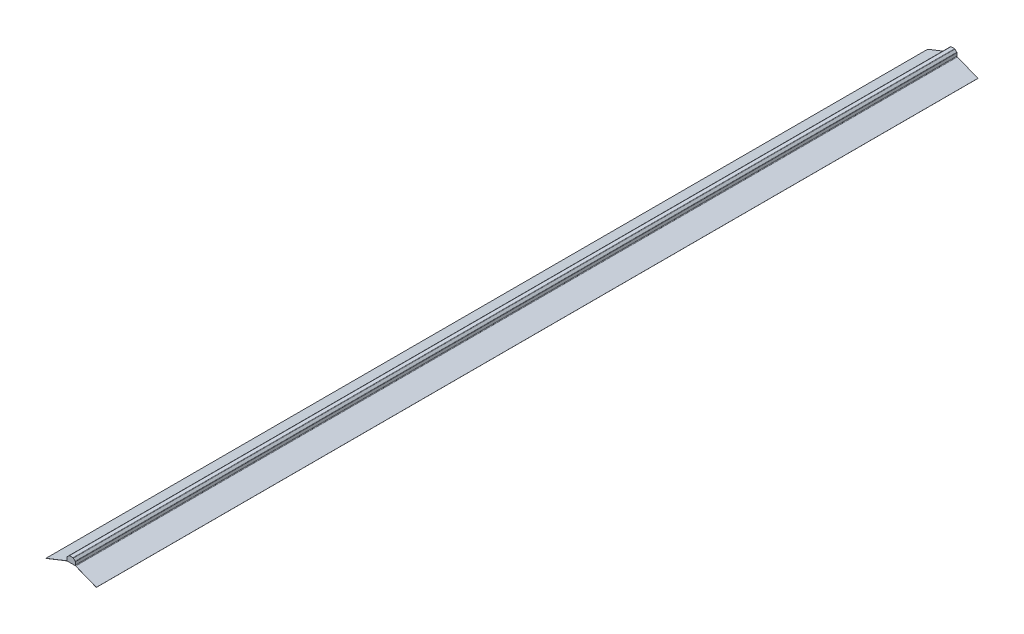
ISO-10303-21;
HEADER;
FILE_DESCRIPTION(('STEP AP214'),'2;1');
FILE_NAME('part.step','',(''),(''),'','','');
FILE_SCHEMA(('AUTOMOTIVE_DESIGN { 1 0 10303 214 1 1 1 1 }'));
ENDSEC;
DATA;
#1=APPLICATION_CONTEXT('core data for automotive mechanical design processes');
#2=APPLICATION_PROTOCOL_DEFINITION('international standard','automotive_design',2000,#1);
#3=PRODUCT_CONTEXT('',#1,'mechanical');
#4=PRODUCT('Part','Part','',(#3));
#5=PRODUCT_RELATED_PRODUCT_CATEGORY('part','',(#4));
#6=PRODUCT_DEFINITION_FORMATION('','',#4);
#7=PRODUCT_DEFINITION_CONTEXT('part definition',#1,'design');
#8=PRODUCT_DEFINITION('design','',#6,#7);
#9=PRODUCT_DEFINITION_SHAPE('','',#8);
#10=(LENGTH_UNIT() NAMED_UNIT(*) SI_UNIT(.MILLI.,.METRE.));
#11=(NAMED_UNIT(*) PLANE_ANGLE_UNIT() SI_UNIT($,.RADIAN.));
#12=(NAMED_UNIT(*) SI_UNIT($,.STERADIAN.) SOLID_ANGLE_UNIT());
#13=UNCERTAINTY_MEASURE_WITH_UNIT(LENGTH_MEASURE(1.E-05),#10,'distance_accuracy_value','');
#14=(GEOMETRIC_REPRESENTATION_CONTEXT(3) GLOBAL_UNCERTAINTY_ASSIGNED_CONTEXT((#13)) GLOBAL_UNIT_ASSIGNED_CONTEXT((#10,
#11,#12)) REPRESENTATION_CONTEXT('',''));
#15=CARTESIAN_POINT('',(0.,0.,0.));
#16=DIRECTION('',(0.,0.,1.));
#17=DIRECTION('',(1.,0.,0.));
#18=AXIS2_PLACEMENT_3D('',#15,#16,#17);
#19=CARTESIAN_POINT('',(37.00272,0.,-3962.146));
#20=DIRECTION('',(0.,-1.,0.));
#21=DIRECTION('',(0.,0.,-1.));
#22=AXIS2_PLACEMENT_3D('',#19,#20,#21);
#23=PLANE('',#22);
#24=DIRECTION('',(0.,0.,1.));
#25=VECTOR('',#24,1.);
#26=CARTESIAN_POINT('',(-37.00272,0.,-3962.146));
#27=LINE('',#26,#25);
#28=CARTESIAN_POINT('',(-37.00272,0.,3961.3332));
#29=VERTEX_POINT('',#28);
#30=CARTESIAN_POINT('',(-37.00272,0.,3962.146));
#31=VERTEX_POINT('',#30);
#32=EDGE_CURVE('E384',#29,#31,#27,.T.);
#33=ORIENTED_EDGE('',*,*,#32,.F.);
#34=DIRECTION('',(1.,0.,0.));
#35=VECTOR('',#34,1.);
#36=CARTESIAN_POINT('',(0.,0.,3961.3332));
#37=LINE('',#36,#35);
#38=CARTESIAN_POINT('',(37.00272,0.,3961.3332));
#39=VERTEX_POINT('',#38);
#40=EDGE_CURVE('E45',#29,#39,#37,.T.);
#41=ORIENTED_EDGE('',*,*,#40,.T.);
#42=DIRECTION('',(0.,0.,1.));
#43=VECTOR('',#42,1.);
#44=CARTESIAN_POINT('',(37.00272,0.,-3962.146));
#45=LINE('',#44,#43);
#46=CARTESIAN_POINT('',(37.00272,0.,3962.146));
#47=VERTEX_POINT('',#46);
#48=EDGE_CURVE('E379',#39,#47,#45,.T.);
#49=ORIENTED_EDGE('',*,*,#48,.T.);
#50=DIRECTION('',(1.,0.,0.));
#51=VECTOR('',#50,1.);
#52=CARTESIAN_POINT('',(37.00272,0.,3962.146));
#53=LINE('',#52,#51);
#54=EDGE_CURVE('E341',#31,#47,#53,.T.);
#55=ORIENTED_EDGE('',*,*,#54,.F.);
#56=EDGE_LOOP('',(#33,#41,#49,#55));
#57=FACE_BOUND('',#56,.T.);
#58=ADVANCED_FACE('F36',(#57),#23,.T.);
#59=CARTESIAN_POINT('',(37.00272,0.,-3962.146));
#60=DIRECTION('',(-0.366842217949024,-0.930283175775119,0.));
#61=DIRECTION('',(0.930283175775119,-0.366842217949024,0.));
#62=AXIS2_PLACEMENT_3D('',#59,#60,#61);
#63=PLANE('',#62);
#64=DIRECTION('',(0.,0.,1.));
#65=VECTOR('',#64,1.);
#66=CARTESIAN_POINT('',(226.036261317504,-74.5423386872416,-3962.146));
#67=LINE('',#66,#65);
#68=CARTESIAN_POINT('',(226.036261317504,-74.5423386872416,-3962.146));
#69=VERTEX_POINT('',#68);
#70=CARTESIAN_POINT('',(226.036261317504,-74.5423386872416,3962.146));
#71=VERTEX_POINT('',#70);
#72=EDGE_CURVE('E373',#69,#71,#67,.T.);
#73=ORIENTED_EDGE('',*,*,#72,.T.);
#74=DIRECTION('',(0.930283175775119,-0.366842217949023,0.));
#75=VECTOR('',#74,1.);
#76=CARTESIAN_POINT('',(37.00272,0.,3962.146));
#77=LINE('',#76,#75);
#78=EDGE_CURVE('E315',#47,#71,#77,.T.);
#79=ORIENTED_EDGE('',*,*,#78,.F.);
#80=ORIENTED_EDGE('',*,*,#48,.F.);
#81=CARTESIAN_POINT('',(37.00272,0.,-3961.3332));
#82=VERTEX_POINT('',#81);
#83=EDGE_CURVE('E378',#82,#39,#45,.T.);
#84=ORIENTED_EDGE('',*,*,#83,.F.);
#85=CARTESIAN_POINT('',(37.00272,0.,-3962.146));
#86=VERTEX_POINT('',#85);
#87=EDGE_CURVE('E374',#86,#82,#45,.T.);
#88=ORIENTED_EDGE('',*,*,#87,.F.);
#89=DIRECTION('',(0.930283175775119,-0.366842217949023,0.));
#90=VECTOR('',#89,1.);
#91=CARTESIAN_POINT('',(37.00272,0.,-3962.146));
#92=LINE('',#91,#90);
#93=EDGE_CURVE('E344',#86,#69,#92,.T.);
#94=ORIENTED_EDGE('',*,*,#93,.T.);
#95=EDGE_LOOP('',(#73,#79,#80,#84,#88,#94));
#96=FACE_BOUND('',#95,.T.);
#97=ADVANCED_FACE('F527',(#96),#63,.T.);
#98=DIRECTION('',(1.,0.,0.));
#99=VECTOR('',#98,1.);
#100=CARTESIAN_POINT('',(0.,0.,-3961.3332));
#101=LINE('',#100,#99);
#102=CARTESIAN_POINT('',(-37.00272,0.,-3961.3332));
#103=VERTEX_POINT('',#102);
#104=EDGE_CURVE('E11',#103,#82,#101,.T.);
#105=ORIENTED_EDGE('',*,*,#104,.F.);
#106=CARTESIAN_POINT('',(-37.00272,0.,-3962.146));
#107=VERTEX_POINT('',#106);
#108=EDGE_CURVE('E380',#107,#103,#27,.T.);
#109=ORIENTED_EDGE('',*,*,#108,.F.);
#110=DIRECTION('',(1.,0.,0.));
#111=VECTOR('',#110,1.);
#112=CARTESIAN_POINT('',(37.00272,0.,-3962.146));
#113=LINE('',#112,#111);
#114=EDGE_CURVE('E370',#107,#86,#113,.T.);
#115=ORIENTED_EDGE('',*,*,#114,.T.);
#116=ORIENTED_EDGE('',*,*,#87,.T.);
#117=EDGE_LOOP('',(#105,#109,#115,#116));
#118=FACE_BOUND('',#117,.T.);
#119=ADVANCED_FACE('F529',(#118),#23,.T.);
#120=CARTESIAN_POINT('',(-37.00272,0.,-3962.146));
#121=DIRECTION('',(0.366842217949024,-0.930283175775119,0.));
#122=DIRECTION('',(0.930283175775119,0.366842217949024,0.));
#123=AXIS2_PLACEMENT_3D('',#120,#121,#122);
#124=PLANE('',#123);
#125=ORIENTED_EDGE('',*,*,#108,.T.);
#126=EDGE_CURVE('E383',#103,#29,#27,.T.);
#127=ORIENTED_EDGE('',*,*,#126,.T.);
#128=ORIENTED_EDGE('',*,*,#32,.T.);
#129=DIRECTION('',(0.930283175775119,0.366842217949023,0.));
#130=VECTOR('',#129,1.);
#131=CARTESIAN_POINT('',(-37.00272,0.,3962.146));
#132=LINE('',#131,#130);
#133=CARTESIAN_POINT('',(-226.036261317504,-74.5423386872416,3962.146));
#134=VERTEX_POINT('',#133);
#135=EDGE_CURVE('E338',#134,#31,#132,.T.);
#136=ORIENTED_EDGE('',*,*,#135,.F.);
#137=DIRECTION('',(0.,0.,1.));
#138=VECTOR('',#137,1.);
#139=CARTESIAN_POINT('',(-226.036261317504,-74.5423386872416,-3962.146));
#140=LINE('',#139,#138);
#141=CARTESIAN_POINT('',(-226.036261317504,-74.5423386872416,-3962.146));
#142=VERTEX_POINT('',#141);
#143=EDGE_CURVE('E385',#142,#134,#140,.T.);
#144=ORIENTED_EDGE('',*,*,#143,.F.);
#145=DIRECTION('',(0.930283175775119,0.366842217949023,0.));
#146=VECTOR('',#145,1.);
#147=CARTESIAN_POINT('',(-37.00272,0.,-3962.146));
#148=LINE('',#147,#146);
#149=EDGE_CURVE('E367',#142,#107,#148,.T.);
#150=ORIENTED_EDGE('',*,*,#149,.T.);
#151=EDGE_LOOP('',(#125,#127,#128,#136,#144,#150));
#152=FACE_BOUND('',#151,.T.);
#153=ADVANCED_FACE('F538',(#152),#124,.T.);
#154=CARTESIAN_POINT('',(-226.036261317504,-74.5423386872416,-3962.146));
#155=DIRECTION('',(-0.930283175775118,-0.366842217949027,0.));
#156=DIRECTION('',(0.366842217949027,-0.930283175775118,0.));
#157=AXIS2_PLACEMENT_3D('',#154,#155,#156);
#158=PLANE('',#157);
#159=ORIENTED_EDGE('',*,*,#143,.T.);
#160=DIRECTION('',(0.366842217949027,-0.930283175775118,0.));
#161=VECTOR('',#160,1.);
#162=CARTESIAN_POINT('',(-226.036261317504,-74.5423386872416,3962.146));
#163=LINE('',#162,#161);
#164=CARTESIAN_POINT('',(-226.334430672253,-73.7862045219716,3962.146));
#165=VERTEX_POINT('',#164);
#166=EDGE_CURVE('E335',#165,#134,#163,.T.);
#167=ORIENTED_EDGE('',*,*,#166,.F.);
#168=DIRECTION('',(0.,0.,1.));
#169=VECTOR('',#168,1.);
#170=CARTESIAN_POINT('',(-226.334430672253,-73.7862045219716,-3962.146));
#171=LINE('',#170,#169);
#172=CARTESIAN_POINT('',(-226.334430672253,-73.7862045219716,-3962.146));
#173=VERTEX_POINT('',#172);
#174=EDGE_CURVE('E387',#173,#165,#171,.T.);
#175=ORIENTED_EDGE('',*,*,#174,.F.);
#176=DIRECTION('',(0.366842217949027,-0.930283175775118,0.));
#177=VECTOR('',#176,1.);
#178=CARTESIAN_POINT('',(-226.036261317504,-74.5423386872416,-3962.146));
#179=LINE('',#178,#177);
#180=EDGE_CURVE('E364',#173,#142,#179,.T.);
#181=ORIENTED_EDGE('',*,*,#180,.T.);
#182=EDGE_LOOP('',(#159,#167,#175,#181));
#183=FACE_BOUND('',#182,.T.);
#184=ADVANCED_FACE('F543',(#183),#158,.T.);
#185=CARTESIAN_POINT('',(-226.334430672253,-73.7862045219716,-3962.146));
#186=DIRECTION('',(-0.366842217949023,0.930283175775119,0.));
#187=DIRECTION('',(-0.930283175775119,-0.366842217949023,0.));
#188=AXIS2_PLACEMENT_3D('',#185,#186,#187);
#189=PLANE('',#188);
#190=DIRECTION('',(-0.930283175775119,-0.366842217949023,0.));
#191=VECTOR('',#190,1.);
#192=CARTESIAN_POINT('',(-226.334430672253,-73.7862045219716,3962.146));
#193=LINE('',#192,#191);
#194=CARTESIAN_POINT('',(-41.1777411454559,-0.772640025854851,3962.146));
#195=VERTEX_POINT('',#194);
#196=EDGE_CURVE('E333',#195,#165,#193,.T.);
#197=ORIENTED_EDGE('',*,*,#196,.F.);
#198=DIRECTION('',(0.,0.,1.));
#199=VECTOR('',#198,1.);
#200=CARTESIAN_POINT('',(-41.1777411454559,-0.772640025854849,-3962.146));
#201=LINE('',#200,#199);
#202=CARTESIAN_POINT('',(-41.1777411454559,-0.772640025854851,-3962.146));
#203=VERTEX_POINT('',#202);
#204=EDGE_CURVE('E410',#195,#203,#201,.F.);
#205=ORIENTED_EDGE('',*,*,#204,.T.);
#206=DIRECTION('',(-0.930283175775119,-0.366842217949023,0.));
#207=VECTOR('',#206,1.);
#208=CARTESIAN_POINT('',(-226.334430672253,-73.7862045219716,-3962.146));
#209=LINE('',#208,#207);
#210=EDGE_CURVE('E362',#203,#173,#209,.T.);
#211=ORIENTED_EDGE('',*,*,#210,.T.);
#212=ORIENTED_EDGE('',*,*,#174,.T.);
#213=EDGE_LOOP('',(#197,#205,#211,#212));
#214=FACE_BOUND('',#213,.T.);
#215=ADVANCED_FACE('F842',(#214),#189,.T.);
#216=CARTESIAN_POINT('',(-37.1571892294322,0.812800000000105,-3962.146));
#217=DIRECTION('',(-1.,0.,0.));
#218=DIRECTION('',(0.,-1.,0.));
#219=AXIS2_PLACEMENT_3D('',#216,#217,#218);
#220=PLANE('',#219);
#221=DIRECTION('',(0.,-1.,0.));
#222=VECTOR('',#221,1.);
#223=CARTESIAN_POINT('',(-37.1571892294322,0.812800000000105,-3962.146));
#224=LINE('',#223,#222);
#225=CARTESIAN_POINT('',(-37.1571892294323,29.9325438789302,-3962.146));
#226=VERTEX_POINT('',#225);
#227=CARTESIAN_POINT('',(-37.1571892294322,5.13465814031717,-3962.146));
#228=VERTEX_POINT('',#227);
#229=EDGE_CURVE('E359',#226,#228,#224,.T.);
#230=ORIENTED_EDGE('',*,*,#229,.T.);
#231=DIRECTION('',(0.,0.,1.));
#232=VECTOR('',#231,1.);
#233=CARTESIAN_POINT('',(-37.1571892294322,5.13465814031717,3962.146));
#234=LINE('',#233,#232);
#235=CARTESIAN_POINT('',(-37.1571892294322,5.13465814031717,3962.146));
#236=VERTEX_POINT('',#235);
#237=EDGE_CURVE('E407',#228,#236,#234,.T.);
#238=ORIENTED_EDGE('',*,*,#237,.T.);
#239=DIRECTION('',(0.,-1.,0.));
#240=VECTOR('',#239,1.);
#241=CARTESIAN_POINT('',(-37.1571892294322,0.812800000000105,3962.146));
#242=LINE('',#241,#240);
#243=CARTESIAN_POINT('',(-37.1571892294323,29.9325438789302,3962.146));
#244=VERTEX_POINT('',#243);
#245=EDGE_CURVE('E330',#244,#236,#242,.T.);
#246=ORIENTED_EDGE('',*,*,#245,.F.);
#247=DIRECTION('',(0.,0.,1.));
#248=VECTOR('',#247,1.);
#249=CARTESIAN_POINT('',(-37.1571892294323,29.9325438789302,-3962.146));
#250=LINE('',#249,#248);
#251=EDGE_CURVE('E404',#244,#226,#250,.F.);
#252=ORIENTED_EDGE('',*,*,#251,.T.);
#253=EDGE_LOOP('',(#230,#238,#246,#252));
#254=FACE_BOUND('',#253,.T.);
#255=ADVANCED_FACE('F573',(#254),#220,.T.);
#256=CARTESIAN_POINT('',(-37.1571892294323,51.6128000000002,-3962.146));
#257=DIRECTION('',(0.,1.,0.));
#258=DIRECTION('',(0.,0.,1.));
#259=AXIS2_PLACEMENT_3D('',#256,#257,#258);
#260=PLANE('',#259);
#261=DIRECTION('',(-1.,0.,0.));
#262=VECTOR('',#261,1.);
#263=CARTESIAN_POINT('',(-37.1571892294323,51.6128000000002,-3962.146));
#264=LINE('',#263,#262);
#265=CARTESIAN_POINT('',(15.4769331083631,51.6128000000002,-3962.146));
#266=VERTEX_POINT('',#265);
#267=CARTESIAN_POINT('',(-15.4769331083622,51.6128000000002,-3962.146));
#268=VERTEX_POINT('',#267);
#269=EDGE_CURVE('E356',#266,#268,#264,.T.);
#270=ORIENTED_EDGE('',*,*,#269,.T.);
#271=DIRECTION('',(0.,0.,-1.));
#272=VECTOR('',#271,1.);
#273=CARTESIAN_POINT('',(-15.4769331083622,51.6128000000002,-3962.146));
#274=LINE('',#273,#272);
#275=CARTESIAN_POINT('',(-15.4769331083622,51.6128000000002,3962.146));
#276=VERTEX_POINT('',#275);
#277=EDGE_CURVE('E442',#268,#276,#274,.F.);
#278=ORIENTED_EDGE('',*,*,#277,.T.);
#279=DIRECTION('',(-1.,0.,0.));
#280=VECTOR('',#279,1.);
#281=CARTESIAN_POINT('',(-37.1571892294323,51.6128000000002,3962.146));
#282=LINE('',#281,#280);
#283=CARTESIAN_POINT('',(15.4769331083631,51.6128000000002,3962.146));
#284=VERTEX_POINT('',#283);
#285=EDGE_CURVE('E327',#284,#276,#282,.T.);
#286=ORIENTED_EDGE('',*,*,#285,.F.);
#287=DIRECTION('',(0.,0.,1.));
#288=VECTOR('',#287,1.);
#289=CARTESIAN_POINT('',(15.4769331083631,51.6128000000002,-3962.146));
#290=LINE('',#289,#288);
#291=EDGE_CURVE('E439',#284,#266,#290,.F.);
#292=ORIENTED_EDGE('',*,*,#291,.T.);
#293=EDGE_LOOP('',(#270,#278,#286,#292));
#294=FACE_BOUND('',#293,.T.);
#295=ADVANCED_FACE('F587',(#294),#260,.T.);
#296=CARTESIAN_POINT('',(37.1571892294322,0.812800000000105,-3962.146));
#297=DIRECTION('',(1.,0.,0.));
#298=DIRECTION('',(0.,1.,0.));
#299=AXIS2_PLACEMENT_3D('',#296,#297,#298);
#300=PLANE('',#299);
#301=DIRECTION('',(0.,1.,0.));
#302=VECTOR('',#301,1.);
#303=CARTESIAN_POINT('',(37.1571892294322,0.812800000000105,3962.146));
#304=LINE('',#303,#302);
#305=CARTESIAN_POINT('',(37.1571892294322,5.13465814031717,3962.146));
#306=VERTEX_POINT('',#305);
#307=CARTESIAN_POINT('',(37.1571892294323,29.932543878931,3962.146));
#308=VERTEX_POINT('',#307);
#309=EDGE_CURVE('E324',#306,#308,#304,.T.);
#310=ORIENTED_EDGE('',*,*,#309,.F.);
#311=DIRECTION('',(0.,0.,1.));
#312=VECTOR('',#311,1.);
#313=CARTESIAN_POINT('',(37.1571892294322,5.13465814031717,-3962.146));
#314=LINE('',#313,#312);
#315=CARTESIAN_POINT('',(37.1571892294322,5.13465814031717,-3962.146));
#316=VERTEX_POINT('',#315);
#317=EDGE_CURVE('E418',#306,#316,#314,.F.);
#318=ORIENTED_EDGE('',*,*,#317,.T.);
#319=DIRECTION('',(0.,1.,0.));
#320=VECTOR('',#319,1.);
#321=CARTESIAN_POINT('',(37.1571892294322,0.812800000000105,-3962.146));
#322=LINE('',#321,#320);
#323=CARTESIAN_POINT('',(37.1571892294323,29.932543878931,-3962.146));
#324=VERTEX_POINT('',#323);
#325=EDGE_CURVE('E353',#316,#324,#322,.T.);
#326=ORIENTED_EDGE('',*,*,#325,.T.);
#327=DIRECTION('',(0.,0.,-1.));
#328=VECTOR('',#327,1.);
#329=CARTESIAN_POINT('',(37.1571892294323,29.932543878931,-3962.146));
#330=LINE('',#329,#328);
#331=EDGE_CURVE('E415',#324,#308,#330,.F.);
#332=ORIENTED_EDGE('',*,*,#331,.T.);
#333=EDGE_LOOP('',(#310,#318,#326,#332));
#334=FACE_BOUND('',#333,.T.);
#335=ADVANCED_FACE('F603',(#334),#300,.T.);
#336=CARTESIAN_POINT('',(226.334430672253,-73.7862045219716,-3962.146));
#337=DIRECTION('',(0.366842217949023,0.930283175775119,0.));
#338=DIRECTION('',(-0.930283175775119,0.366842217949023,0.));
#339=AXIS2_PLACEMENT_3D('',#336,#337,#338);
#340=PLANE('',#339);
#341=DIRECTION('',(-0.930283175775119,0.366842217949023,0.));
#342=VECTOR('',#341,1.);
#343=CARTESIAN_POINT('',(226.334430672253,-73.7862045219716,-3962.146));
#344=LINE('',#343,#342);
#345=CARTESIAN_POINT('',(226.334430672253,-73.7862045219716,-3962.146));
#346=VERTEX_POINT('',#345);
#347=CARTESIAN_POINT('',(41.177741145456,-0.772640025854865,-3962.146));
#348=VERTEX_POINT('',#347);
#349=EDGE_CURVE('E350',#346,#348,#344,.T.);
#350=ORIENTED_EDGE('',*,*,#349,.T.);
#351=DIRECTION('',(0.,0.,1.));
#352=VECTOR('',#351,1.);
#353=CARTESIAN_POINT('',(41.1777411454559,-0.772640025854854,3962.146));
#354=LINE('',#353,#352);
#355=CARTESIAN_POINT('',(41.177741145456,-0.772640025854865,3962.146));
#356=VERTEX_POINT('',#355);
#357=EDGE_CURVE('E412',#348,#356,#354,.T.);
#358=ORIENTED_EDGE('',*,*,#357,.T.);
#359=DIRECTION('',(-0.930283175775119,0.366842217949023,0.));
#360=VECTOR('',#359,1.);
#361=CARTESIAN_POINT('',(226.334430672253,-73.7862045219716,3962.146));
#362=LINE('',#361,#360);
#363=CARTESIAN_POINT('',(226.334430672253,-73.7862045219716,3962.146));
#364=VERTEX_POINT('',#363);
#365=EDGE_CURVE('E321',#364,#356,#362,.T.);
#366=ORIENTED_EDGE('',*,*,#365,.F.);
#367=DIRECTION('',(0.,0.,1.));
#368=VECTOR('',#367,1.);
#369=CARTESIAN_POINT('',(226.334430672253,-73.7862045219716,-3962.146));
#370=LINE('',#369,#368);
#371=EDGE_CURVE('E390',#346,#364,#370,.T.);
#372=ORIENTED_EDGE('',*,*,#371,.F.);
#373=EDGE_LOOP('',(#350,#358,#366,#372));
#374=FACE_BOUND('',#373,.T.);
#375=ADVANCED_FACE('F610',(#374),#340,.T.);
#376=CARTESIAN_POINT('',(226.036261317504,-74.5423386872416,-3962.146));
#377=DIRECTION('',(0.930283175775118,-0.366842217949027,0.));
#378=DIRECTION('',(0.366842217949027,0.930283175775118,0.));
#379=AXIS2_PLACEMENT_3D('',#376,#377,#378);
#380=PLANE('',#379);
#381=ORIENTED_EDGE('',*,*,#371,.T.);
#382=DIRECTION('',(0.366842217949027,0.930283175775118,0.));
#383=VECTOR('',#382,1.);
#384=CARTESIAN_POINT('',(226.036261317504,-74.5423386872416,3962.146));
#385=LINE('',#384,#383);
#386=EDGE_CURVE('E318',#71,#364,#385,.T.);
#387=ORIENTED_EDGE('',*,*,#386,.F.);
#388=ORIENTED_EDGE('',*,*,#72,.F.);
#389=DIRECTION('',(0.366842217949027,0.930283175775118,0.));
#390=VECTOR('',#389,1.);
#391=CARTESIAN_POINT('',(226.036261317504,-74.5423386872416,-3962.146));
#392=LINE('',#391,#390);
#393=EDGE_CURVE('E347',#69,#346,#392,.T.);
#394=ORIENTED_EDGE('',*,*,#393,.T.);
#395=EDGE_LOOP('',(#381,#387,#388,#394));
#396=FACE_BOUND('',#395,.T.);
#397=ADVANCED_FACE('F612',(#396),#380,.T.);
#398=CARTESIAN_POINT('',(0.,0.,-3962.146));
#399=DIRECTION('',(0.,0.,1.));
#400=DIRECTION('',(1.,0.,0.));
#401=AXIS2_PLACEMENT_3D('',#398,#399,#400);
#402=PLANE('',#401);
#403=ORIENTED_EDGE('',*,*,#229,.F.);
#404=CARTESIAN_POINT('',(-30.8071892294323,29.9325438789302,-3962.146));
#405=DIRECTION('',(0.,0.,1.));
#406=DIRECTION('',(1.,0.,0.));
#407=AXIS2_PLACEMENT_3D('',#404,#405,#406);
#408=CIRCLE('',#407,6.35);
#409=CARTESIAN_POINT('',(-35.2973172899668,34.4226719394647,-3962.146));
#410=VERTEX_POINT('',#409);
#411=EDGE_CURVE('E426',#226,#410,#408,.F.);
#412=ORIENTED_EDGE('',*,*,#411,.T.);
#413=DIRECTION('',(-0.707106781186547,-0.707106781186548,0.));
#414=VECTOR('',#413,1.);
#415=CARTESIAN_POINT('',(-18.1071892294314,51.6128000000002,-3962.146));
#416=LINE('',#415,#414);
#417=CARTESIAN_POINT('',(-19.9670611688968,49.7529280605348,-3962.146));
#418=VERTEX_POINT('',#417);
#419=EDGE_CURVE('E398',#410,#418,#416,.F.);
#420=ORIENTED_EDGE('',*,*,#419,.T.);
#421=CARTESIAN_POINT('',(-15.4769331083622,45.2628000000002,-3962.146));
#422=DIRECTION('',(0.,0.,1.));
#423=DIRECTION('',(1.,0.,0.));
#424=AXIS2_PLACEMENT_3D('',#421,#422,#423);
#425=CIRCLE('',#424,6.35);
#426=EDGE_CURVE('E424',#418,#268,#425,.F.);
#427=ORIENTED_EDGE('',*,*,#426,.T.);
#428=ORIENTED_EDGE('',*,*,#269,.F.);
#429=CARTESIAN_POINT('',(15.4769331083631,45.2628000000002,-3962.146));
#430=DIRECTION('',(0.,0.,1.));
#431=DIRECTION('',(1.,0.,0.));
#432=AXIS2_PLACEMENT_3D('',#429,#430,#431);
#433=CIRCLE('',#432,6.35);
#434=CARTESIAN_POINT('',(19.9670611688977,49.7529280605348,-3962.146));
#435=VERTEX_POINT('',#434);
#436=EDGE_CURVE('E420',#266,#435,#433,.F.);
#437=ORIENTED_EDGE('',*,*,#436,.T.);
#438=DIRECTION('',(-0.707106781186547,0.707106781186548,0.));
#439=VECTOR('',#438,1.);
#440=CARTESIAN_POINT('',(37.1571892294323,32.5628000000002,-3962.146));
#441=LINE('',#440,#439);
#442=CARTESIAN_POINT('',(35.2973172899668,34.4226719394656,-3962.146));
#443=VERTEX_POINT('',#442);
#444=EDGE_CURVE('E401',#435,#443,#441,.F.);
#445=ORIENTED_EDGE('',*,*,#444,.T.);
#446=CARTESIAN_POINT('',(30.8071892294323,29.932543878931,-3962.146));
#447=DIRECTION('',(0.,0.,1.));
#448=DIRECTION('',(1.,0.,0.));
#449=AXIS2_PLACEMENT_3D('',#446,#447,#448);
#450=CIRCLE('',#449,6.35);
#451=EDGE_CURVE('E422',#443,#324,#450,.F.);
#452=ORIENTED_EDGE('',*,*,#451,.T.);
#453=ORIENTED_EDGE('',*,*,#325,.F.);
#454=CARTESIAN_POINT('',(43.5071892294322,5.13465814031716,-3962.146));
#455=DIRECTION('',(0.,0.,1.));
#456=DIRECTION('',(1.,0.,0.));
#457=AXIS2_PLACEMENT_3D('',#454,#455,#456);
#458=CIRCLE('',#457,6.35);
#459=EDGE_CURVE('E40',#316,#348,#458,.T.);
#460=ORIENTED_EDGE('',*,*,#459,.T.);
#461=ORIENTED_EDGE('',*,*,#349,.F.);
#462=ORIENTED_EDGE('',*,*,#393,.F.);
#463=ORIENTED_EDGE('',*,*,#93,.F.);
#464=ORIENTED_EDGE('',*,*,#114,.F.);
#465=ORIENTED_EDGE('',*,*,#149,.F.);
#466=ORIENTED_EDGE('',*,*,#180,.F.);
#467=ORIENTED_EDGE('',*,*,#210,.F.);
#468=CARTESIAN_POINT('',(-43.5071892294322,5.13465814031717,-3962.146));
#469=DIRECTION('',(0.,0.,1.));
#470=DIRECTION('',(1.,0.,0.));
#471=AXIS2_PLACEMENT_3D('',#468,#469,#470);
#472=CIRCLE('',#471,6.35);
#473=EDGE_CURVE('E450',#203,#228,#472,.T.);
#474=ORIENTED_EDGE('',*,*,#473,.T.);
#475=EDGE_LOOP('',(#403,#412,#420,#427,#428,#437,#445,#452,#453,#460,#461,#462,#463,#464,#465,
#466,#467,#474));
#476=FACE_BOUND('',#475,.T.);
#477=ADVANCED_FACE('F554',(#476),#402,.F.);
#478=CARTESIAN_POINT('',(0.,0.,3962.146));
#479=DIRECTION('',(0.,0.,1.));
#480=DIRECTION('',(1.,0.,0.));
#481=AXIS2_PLACEMENT_3D('',#478,#479,#480);
#482=PLANE('',#481);
#483=DIRECTION('',(0.707106781186547,0.707106781186548,0.));
#484=VECTOR('',#483,1.);
#485=CARTESIAN_POINT('',(-34.8599946147158,34.8599946147158,3962.146));
#486=LINE('',#485,#484);
#487=CARTESIAN_POINT('',(-19.9670611688968,49.7529280605348,3962.146));
#488=VERTEX_POINT('',#487);
#489=CARTESIAN_POINT('',(-35.2973172899668,34.4226719394647,3962.146));
#490=VERTEX_POINT('',#489);
#491=EDGE_CURVE('E377',#488,#490,#486,.F.);
#492=ORIENTED_EDGE('',*,*,#491,.T.);
#493=CARTESIAN_POINT('',(-30.8071892294323,29.9325438789302,3962.146));
#494=DIRECTION('',(0.,0.,1.));
#495=DIRECTION('',(1.,0.,0.));
#496=AXIS2_PLACEMENT_3D('',#493,#494,#495);
#497=CIRCLE('',#496,6.35);
#498=EDGE_CURVE('E437',#490,#244,#497,.T.);
#499=ORIENTED_EDGE('',*,*,#498,.T.);
#500=ORIENTED_EDGE('',*,*,#245,.T.);
#501=CARTESIAN_POINT('',(-43.5071892294322,5.13465814031717,3962.146));
#502=DIRECTION('',(0.,0.,1.));
#503=DIRECTION('',(1.,0.,0.));
#504=AXIS2_PLACEMENT_3D('',#501,#502,#503);
#505=CIRCLE('',#504,6.35);
#506=EDGE_CURVE('E448',#236,#195,#505,.F.);
#507=ORIENTED_EDGE('',*,*,#506,.T.);
#508=ORIENTED_EDGE('',*,*,#196,.T.);
#509=ORIENTED_EDGE('',*,*,#166,.T.);
#510=ORIENTED_EDGE('',*,*,#135,.T.);
#511=ORIENTED_EDGE('',*,*,#54,.T.);
#512=ORIENTED_EDGE('',*,*,#78,.T.);
#513=ORIENTED_EDGE('',*,*,#386,.T.);
#514=ORIENTED_EDGE('',*,*,#365,.T.);
#515=CARTESIAN_POINT('',(43.5071892294322,5.13465814031716,3962.146));
#516=DIRECTION('',(0.,0.,1.));
#517=DIRECTION('',(1.,0.,0.));
#518=AXIS2_PLACEMENT_3D('',#515,#516,#517);
#519=CIRCLE('',#518,6.35);
#520=EDGE_CURVE('E451',#356,#306,#519,.F.);
#521=ORIENTED_EDGE('',*,*,#520,.T.);
#522=ORIENTED_EDGE('',*,*,#309,.T.);
#523=CARTESIAN_POINT('',(30.8071892294323,29.932543878931,3962.146));
#524=DIRECTION('',(0.,0.,1.));
#525=DIRECTION('',(1.,0.,0.));
#526=AXIS2_PLACEMENT_3D('',#523,#524,#525);
#527=CIRCLE('',#526,6.35);
#528=CARTESIAN_POINT('',(35.2973172899668,34.4226719394656,3962.146));
#529=VERTEX_POINT('',#528);
#530=EDGE_CURVE('E434',#308,#529,#527,.T.);
#531=ORIENTED_EDGE('',*,*,#530,.T.);
#532=DIRECTION('',(0.707106781186547,-0.707106781186548,0.));
#533=VECTOR('',#532,1.);
#534=CARTESIAN_POINT('',(34.8599946147162,34.8599946147162,3962.146));
#535=LINE('',#534,#533);
#536=CARTESIAN_POINT('',(19.9670611688977,49.7529280605348,3962.146));
#537=VERTEX_POINT('',#536);
#538=EDGE_CURVE('E395',#529,#537,#535,.F.);
#539=ORIENTED_EDGE('',*,*,#538,.T.);
#540=CARTESIAN_POINT('',(15.4769331083631,45.2628000000002,3962.146));
#541=DIRECTION('',(0.,0.,1.));
#542=DIRECTION('',(1.,0.,0.));
#543=AXIS2_PLACEMENT_3D('',#540,#541,#542);
#544=CIRCLE('',#543,6.35);
#545=EDGE_CURVE('E432',#537,#284,#544,.T.);
#546=ORIENTED_EDGE('',*,*,#545,.T.);
#547=ORIENTED_EDGE('',*,*,#285,.T.);
#548=CARTESIAN_POINT('',(-15.4769331083622,45.2628000000002,3962.146));
#549=DIRECTION('',(0.,0.,1.));
#550=DIRECTION('',(1.,0.,0.));
#551=AXIS2_PLACEMENT_3D('',#548,#549,#550);
#552=CIRCLE('',#551,6.35);
#553=EDGE_CURVE('E63',#276,#488,#552,.T.);
#554=ORIENTED_EDGE('',*,*,#553,.T.);
#555=EDGE_LOOP('',(#492,#499,#500,#507,#508,#509,#510,#511,#512,#513,#514,#521,#522,#531,#539,
#546,#547,#554));
#556=FACE_BOUND('',#555,.T.);
#557=ADVANCED_FACE('F559',(#556),#482,.T.);
#558=CARTESIAN_POINT('',(37.1571892294323,32.5628000000002,-3962.146));
#559=DIRECTION('',(-0.707106781186548,-0.707106781186547,0.));
#560=DIRECTION('',(0.,0.,1.));
#561=AXIS2_PLACEMENT_3D('',#558,#559,#560);
#562=PLANE('',#561);
#563=ORIENTED_EDGE('',*,*,#538,.F.);
#564=DIRECTION('',(0.,0.,1.));
#565=VECTOR('',#564,1.);
#566=CARTESIAN_POINT('',(35.2973172899668,34.4226719394656,-3962.146));
#567=LINE('',#566,#565);
#568=EDGE_CURVE('E446',#529,#443,#567,.F.);
#569=ORIENTED_EDGE('',*,*,#568,.T.);
#570=ORIENTED_EDGE('',*,*,#444,.F.);
#571=DIRECTION('',(0.,0.,-1.));
#572=VECTOR('',#571,1.);
#573=CARTESIAN_POINT('',(19.9670611688977,49.7529280605348,-3962.146));
#574=LINE('',#573,#572);
#575=EDGE_CURVE('E444',#435,#537,#574,.F.);
#576=ORIENTED_EDGE('',*,*,#575,.T.);
#577=EDGE_LOOP('',(#563,#569,#570,#576));
#578=FACE_BOUND('',#577,.T.);
#579=ADVANCED_FACE('F597',(#578),#562,.F.);
#580=CARTESIAN_POINT('',(-18.1071892294314,51.6128000000002,-3962.146));
#581=DIRECTION('',(0.707106781186548,-0.707106781186547,0.));
#582=DIRECTION('',(0.,0.,1.));
#583=AXIS2_PLACEMENT_3D('',#580,#581,#582);
#584=PLANE('',#583);
#585=ORIENTED_EDGE('',*,*,#419,.F.);
#586=DIRECTION('',(0.,0.,-1.));
#587=VECTOR('',#586,1.);
#588=CARTESIAN_POINT('',(-35.2973172899668,34.4226719394647,-3962.146));
#589=LINE('',#588,#587);
#590=EDGE_CURVE('E430',#410,#490,#589,.F.);
#591=ORIENTED_EDGE('',*,*,#590,.T.);
#592=ORIENTED_EDGE('',*,*,#491,.F.);
#593=DIRECTION('',(0.,0.,1.));
#594=VECTOR('',#593,1.);
#595=CARTESIAN_POINT('',(-19.9670611688968,49.7529280605348,-3962.146));
#596=LINE('',#595,#594);
#597=EDGE_CURVE('E428',#488,#418,#596,.F.);
#598=ORIENTED_EDGE('',*,*,#597,.T.);
#599=EDGE_LOOP('',(#585,#591,#592,#598));
#600=FACE_BOUND('',#599,.T.);
#601=ADVANCED_FACE('F583',(#600),#584,.F.);
#602=CARTESIAN_POINT('',(-43.5071892294322,5.13465814031717,-3962.146));
#603=DIRECTION('',(0.,0.,-1.));
#604=DIRECTION('',(-1.,0.,0.));
#605=AXIS2_PLACEMENT_3D('',#602,#603,#604);
#606=CYLINDRICAL_SURFACE('',#605,6.35);
#607=ORIENTED_EDGE('',*,*,#473,.F.);
#608=ORIENTED_EDGE('',*,*,#204,.F.);
#609=ORIENTED_EDGE('',*,*,#506,.F.);
#610=ORIENTED_EDGE('',*,*,#237,.F.);
#611=EDGE_LOOP('',(#607,#608,#609,#610));
#612=FACE_BOUND('',#611,.T.);
#613=ADVANCED_FACE('F570',(#612),#606,.F.);
#614=CARTESIAN_POINT('',(43.5071892294322,5.13465814031716,-3962.146));
#615=DIRECTION('',(0.,0.,-1.));
#616=DIRECTION('',(-1.,0.,0.));
#617=AXIS2_PLACEMENT_3D('',#614,#615,#616);
#618=CYLINDRICAL_SURFACE('',#617,6.35);
#619=ORIENTED_EDGE('',*,*,#459,.F.);
#620=ORIENTED_EDGE('',*,*,#317,.F.);
#621=ORIENTED_EDGE('',*,*,#520,.F.);
#622=ORIENTED_EDGE('',*,*,#357,.F.);
#623=EDGE_LOOP('',(#619,#620,#621,#622));
#624=FACE_BOUND('',#623,.T.);
#625=ADVANCED_FACE('F606',(#624),#618,.F.);
#626=CARTESIAN_POINT('',(-30.8071892294323,29.9325438789302,-3962.146));
#627=DIRECTION('',(0.,0.,1.));
#628=DIRECTION('',(1.,0.,0.));
#629=AXIS2_PLACEMENT_3D('',#626,#627,#628);
#630=CYLINDRICAL_SURFACE('',#629,6.35);
#631=ORIENTED_EDGE('',*,*,#498,.F.);
#632=ORIENTED_EDGE('',*,*,#590,.F.);
#633=ORIENTED_EDGE('',*,*,#411,.F.);
#634=ORIENTED_EDGE('',*,*,#251,.F.);
#635=EDGE_LOOP('',(#631,#632,#633,#634));
#636=FACE_BOUND('',#635,.T.);
#637=ADVANCED_FACE('F579',(#636),#630,.T.);
#638=CARTESIAN_POINT('',(-15.4769331083622,45.2628000000002,-3962.146));
#639=DIRECTION('',(0.,0.,-1.));
#640=DIRECTION('',(-1.,0.,0.));
#641=AXIS2_PLACEMENT_3D('',#638,#639,#640);
#642=CYLINDRICAL_SURFACE('',#641,6.35);
#643=ORIENTED_EDGE('',*,*,#426,.F.);
#644=ORIENTED_EDGE('',*,*,#597,.F.);
#645=ORIENTED_EDGE('',*,*,#553,.F.);
#646=ORIENTED_EDGE('',*,*,#277,.F.);
#647=EDGE_LOOP('',(#643,#644,#645,#646));
#648=FACE_BOUND('',#647,.T.);
#649=ADVANCED_FACE('F584',(#648),#642,.T.);
#650=CARTESIAN_POINT('',(30.8071892294323,29.932543878931,-3962.146));
#651=DIRECTION('',(0.,0.,-1.));
#652=DIRECTION('',(-1.,0.,0.));
#653=AXIS2_PLACEMENT_3D('',#650,#651,#652);
#654=CYLINDRICAL_SURFACE('',#653,6.35);
#655=ORIENTED_EDGE('',*,*,#451,.F.);
#656=ORIENTED_EDGE('',*,*,#568,.F.);
#657=ORIENTED_EDGE('',*,*,#530,.F.);
#658=ORIENTED_EDGE('',*,*,#331,.F.);
#659=EDGE_LOOP('',(#655,#656,#657,#658));
#660=FACE_BOUND('',#659,.T.);
#661=ADVANCED_FACE('F600',(#660),#654,.T.);
#662=CARTESIAN_POINT('',(15.4769331083631,45.2628000000002,-3962.146));
#663=DIRECTION('',(0.,0.,1.));
#664=DIRECTION('',(1.,0.,0.));
#665=AXIS2_PLACEMENT_3D('',#662,#663,#664);
#666=CYLINDRICAL_SURFACE('',#665,6.35);
#667=ORIENTED_EDGE('',*,*,#545,.F.);
#668=ORIENTED_EDGE('',*,*,#575,.F.);
#669=ORIENTED_EDGE('',*,*,#436,.F.);
#670=ORIENTED_EDGE('',*,*,#291,.F.);
#671=EDGE_LOOP('',(#667,#668,#669,#670));
#672=FACE_BOUND('',#671,.T.);
#673=ADVANCED_FACE('F38',(#672),#666,.T.);
#674=CARTESIAN_POINT('',(37.00272,0.,-3962.146));
#675=DIRECTION('',(0.,-1.,0.));
#676=DIRECTION('',(0.,0.,-1.));
#677=AXIS2_PLACEMENT_3D('',#674,#675,#676);
#678=PLANE('',#677);
#679=CARTESIAN_POINT('',(-38.5130937535653,0.,-3961.3332));
#680=VERTEX_POINT('',#679);
#681=EDGE_CURVE('E47',#680,#103,#101,.T.);
#682=ORIENTED_EDGE('',*,*,#681,.F.);
#683=DIRECTION('',(0.,0.,-1.));
#684=VECTOR('',#683,1.);
#685=CARTESIAN_POINT('',(-38.5130937535653,0.,-3962.146));
#686=LINE('',#685,#684);
#687=CARTESIAN_POINT('',(-38.5130937535653,0.,3961.3332));
#688=VERTEX_POINT('',#687);
#689=EDGE_CURVE('E309',#680,#688,#686,.F.);
#690=ORIENTED_EDGE('',*,*,#689,.T.);
#691=EDGE_CURVE('E304',#688,#29,#37,.T.);
#692=ORIENTED_EDGE('',*,*,#691,.T.);
#693=ORIENTED_EDGE('',*,*,#126,.F.);
#694=EDGE_LOOP('',(#682,#690,#692,#693));
#695=FACE_BOUND('',#694,.T.);
#696=ADVANCED_FACE('F524',(#695),#678,.F.);
#697=ORIENTED_EDGE('',*,*,#83,.T.);
#698=CARTESIAN_POINT('',(38.5130937535653,0.,3961.3332));
#699=VERTEX_POINT('',#698);
#700=EDGE_CURVE('E55',#39,#699,#37,.T.);
#701=ORIENTED_EDGE('',*,*,#700,.T.);
#702=DIRECTION('',(0.,0.,-1.));
#703=VECTOR('',#702,1.);
#704=CARTESIAN_POINT('',(38.5130937535653,0.,-3962.146));
#705=LINE('',#704,#703);
#706=CARTESIAN_POINT('',(38.5130937535653,0.,-3961.3332));
#707=VERTEX_POINT('',#706);
#708=EDGE_CURVE('E311',#707,#699,#705,.F.);
#709=ORIENTED_EDGE('',*,*,#708,.F.);
#710=EDGE_CURVE('E48',#82,#707,#101,.T.);
#711=ORIENTED_EDGE('',*,*,#710,.F.);
#712=EDGE_LOOP('',(#697,#701,#709,#711));
#713=FACE_BOUND('',#712,.T.);
#714=ADVANCED_FACE('F515',(#713),#678,.F.);
#715=CARTESIAN_POINT('',(-36.3443892294322,0.812800000000106,-3962.146));
#716=DIRECTION('',(-1.,0.,0.));
#717=DIRECTION('',(0.,-1.,0.));
#718=AXIS2_PLACEMENT_3D('',#715,#716,#717);
#719=PLANE('',#718);
#720=DIRECTION('',(0.,-1.,0.));
#721=VECTOR('',#720,1.);
#722=CARTESIAN_POINT('',(-36.3443892294322,0.,-3961.3332));
#723=LINE('',#722,#721);
#724=CARTESIAN_POINT('',(-36.3443892294323,29.9325438789302,-3961.3332));
#725=VERTEX_POINT('',#724);
#726=CARTESIAN_POINT('',(-36.3443892294322,5.13465814031717,-3961.3332));
#727=VERTEX_POINT('',#726);
#728=EDGE_CURVE('E510',#725,#727,#723,.T.);
#729=ORIENTED_EDGE('',*,*,#728,.F.);
#730=DIRECTION('',(0.,0.,1.));
#731=VECTOR('',#730,1.);
#732=CARTESIAN_POINT('',(-36.3443892294323,29.9325438789302,-3962.146));
#733=LINE('',#732,#731);
#734=CARTESIAN_POINT('',(-36.3443892294323,29.9325438789302,3961.3332));
#735=VERTEX_POINT('',#734);
#736=EDGE_CURVE('E256',#735,#725,#733,.F.);
#737=ORIENTED_EDGE('',*,*,#736,.F.);
#738=DIRECTION('',(0.,-1.,0.));
#739=VECTOR('',#738,1.);
#740=CARTESIAN_POINT('',(-36.3443892294322,0.,3961.3332));
#741=LINE('',#740,#739);
#742=CARTESIAN_POINT('',(-36.3443892294322,5.13465814031717,3961.3332));
#743=VERTEX_POINT('',#742);
#744=EDGE_CURVE('E462',#735,#743,#741,.T.);
#745=ORIENTED_EDGE('',*,*,#744,.T.);
#746=DIRECTION('',(0.,0.,1.));
#747=VECTOR('',#746,1.);
#748=CARTESIAN_POINT('',(-36.3443892294322,5.13465814031717,-3962.146));
#749=LINE('',#748,#747);
#750=EDGE_CURVE('E301',#727,#743,#749,.T.);
#751=ORIENTED_EDGE('',*,*,#750,.F.);
#752=EDGE_LOOP('',(#729,#737,#745,#751));
#753=FACE_BOUND('',#752,.T.);
#754=ADVANCED_FACE('F512',(#753),#719,.F.);
#755=CARTESIAN_POINT('',(-37.1571892294323,50.8000000000002,-3962.146));
#756=DIRECTION('',(0.,1.,0.));
#757=DIRECTION('',(0.,0.,1.));
#758=AXIS2_PLACEMENT_3D('',#755,#756,#757);
#759=PLANE('',#758);
#760=DIRECTION('',(-1.,0.,0.));
#761=VECTOR('',#760,1.);
#762=CARTESIAN_POINT('',(0.,50.8000000000002,-3961.3332));
#763=LINE('',#762,#761);
#764=CARTESIAN_POINT('',(15.4769331083631,50.8000000000002,-3961.3332));
#765=VERTEX_POINT('',#764);
#766=CARTESIAN_POINT('',(-15.4769331083622,50.8000000000002,-3961.3332));
#767=VERTEX_POINT('',#766);
#768=EDGE_CURVE('E504',#765,#767,#763,.T.);
#769=ORIENTED_EDGE('',*,*,#768,.F.);
#770=DIRECTION('',(0.,0.,1.));
#771=VECTOR('',#770,1.);
#772=CARTESIAN_POINT('',(15.4769331083631,50.8000000000002,-3962.146));
#773=LINE('',#772,#771);
#774=CARTESIAN_POINT('',(15.4769331083631,50.8000000000002,3961.3332));
#775=VERTEX_POINT('',#774);
#776=EDGE_CURVE('E289',#775,#765,#773,.F.);
#777=ORIENTED_EDGE('',*,*,#776,.F.);
#778=DIRECTION('',(-1.,0.,0.));
#779=VECTOR('',#778,1.);
#780=CARTESIAN_POINT('',(0.,50.8000000000002,3961.3332));
#781=LINE('',#780,#779);
#782=CARTESIAN_POINT('',(-15.4769331083622,50.8000000000002,3961.3332));
#783=VERTEX_POINT('',#782);
#784=EDGE_CURVE('E466',#775,#783,#781,.T.);
#785=ORIENTED_EDGE('',*,*,#784,.T.);
#786=DIRECTION('',(0.,0.,1.));
#787=VECTOR('',#786,1.);
#788=CARTESIAN_POINT('',(-15.4769331083622,50.8000000000002,-3962.146));
#789=LINE('',#788,#787);
#790=EDGE_CURVE('E285',#767,#783,#789,.T.);
#791=ORIENTED_EDGE('',*,*,#790,.F.);
#792=EDGE_LOOP('',(#769,#777,#785,#791));
#793=FACE_BOUND('',#792,.T.);
#794=ADVANCED_FACE('F514',(#793),#759,.F.);
#795=CARTESIAN_POINT('',(36.3443892294322,0.812800000000106,-3962.146));
#796=DIRECTION('',(1.,0.,0.));
#797=DIRECTION('',(0.,1.,0.));
#798=AXIS2_PLACEMENT_3D('',#795,#796,#797);
#799=PLANE('',#798);
#800=DIRECTION('',(0.,1.,0.));
#801=VECTOR('',#800,1.);
#802=CARTESIAN_POINT('',(36.3443892294322,0.,3961.3332));
#803=LINE('',#802,#801);
#804=CARTESIAN_POINT('',(36.3443892294322,5.13465814031717,3961.3332));
#805=VERTEX_POINT('',#804);
#806=CARTESIAN_POINT('',(36.3443892294323,29.932543878931,3961.3332));
#807=VERTEX_POINT('',#806);
#808=EDGE_CURVE('E472',#805,#807,#803,.T.);
#809=ORIENTED_EDGE('',*,*,#808,.T.);
#810=DIRECTION('',(0.,0.,1.));
#811=VECTOR('',#810,1.);
#812=CARTESIAN_POINT('',(36.3443892294323,29.932543878931,-3962.146));
#813=LINE('',#812,#811);
#814=CARTESIAN_POINT('',(36.3443892294323,29.932543878931,-3961.3332));
#815=VERTEX_POINT('',#814);
#816=EDGE_CURVE('E297',#815,#807,#813,.T.);
#817=ORIENTED_EDGE('',*,*,#816,.F.);
#818=DIRECTION('',(0.,1.,0.));
#819=VECTOR('',#818,1.);
#820=CARTESIAN_POINT('',(36.3443892294322,0.,-3961.3332));
#821=LINE('',#820,#819);
#822=CARTESIAN_POINT('',(36.3443892294322,5.13465814031717,-3961.3332));
#823=VERTEX_POINT('',#822);
#824=EDGE_CURVE('E306',#823,#815,#821,.T.);
#825=ORIENTED_EDGE('',*,*,#824,.F.);
#826=DIRECTION('',(0.,0.,1.));
#827=VECTOR('',#826,1.);
#828=CARTESIAN_POINT('',(36.3443892294322,5.13465814031717,-3962.146));
#829=LINE('',#828,#827);
#830=EDGE_CURVE('E300',#805,#823,#829,.F.);
#831=ORIENTED_EDGE('',*,*,#830,.F.);
#832=EDGE_LOOP('',(#809,#817,#825,#831));
#833=FACE_BOUND('',#832,.T.);
#834=ADVANCED_FACE('F521',(#833),#799,.F.);
#835=CARTESIAN_POINT('',(0.,0.,-3961.3332));
#836=DIRECTION('',(0.,0.,1.));
#837=DIRECTION('',(1.,0.,0.));
#838=AXIS2_PLACEMENT_3D('',#835,#836,#837);
#839=PLANE('',#838);
#840=ORIENTED_EDGE('',*,*,#728,.T.);
#841=CARTESIAN_POINT('',(-43.5071892294322,5.13465814031717,-3961.3332));
#842=DIRECTION('',(0.,0.,1.));
#843=DIRECTION('',(1.,0.,0.));
#844=AXIS2_PLACEMENT_3D('',#841,#842,#843);
#845=CIRCLE('',#844,7.1628);
#846=EDGE_CURVE('E479',#680,#727,#845,.T.);
#847=ORIENTED_EDGE('',*,*,#846,.F.);
#848=ORIENTED_EDGE('',*,*,#681,.T.);
#849=ORIENTED_EDGE('',*,*,#104,.T.);
#850=ORIENTED_EDGE('',*,*,#710,.T.);
#851=CARTESIAN_POINT('',(43.5071892294322,5.13465814031716,-3961.3332));
#852=DIRECTION('',(0.,0.,1.));
#853=DIRECTION('',(1.,0.,0.));
#854=AXIS2_PLACEMENT_3D('',#851,#852,#853);
#855=CIRCLE('',#854,7.1628);
#856=EDGE_CURVE('E312',#823,#707,#855,.T.);
#857=ORIENTED_EDGE('',*,*,#856,.F.);
#858=ORIENTED_EDGE('',*,*,#824,.T.);
#859=CARTESIAN_POINT('',(30.8071892294323,29.932543878931,-3961.3332));
#860=DIRECTION('',(0.,0.,1.));
#861=DIRECTION('',(1.,0.,0.));
#862=AXIS2_PLACEMENT_3D('',#859,#860,#861);
#863=CIRCLE('',#862,5.5372);
#864=CARTESIAN_POINT('',(34.7225808982184,33.8479355477172,-3961.3332));
#865=VERTEX_POINT('',#864);
#866=EDGE_CURVE('E500',#865,#815,#863,.F.);
#867=ORIENTED_EDGE('',*,*,#866,.F.);
#868=DIRECTION('',(-0.707106781186547,0.707106781186548,0.));
#869=VECTOR('',#868,1.);
#870=CARTESIAN_POINT('',(36.5824528376838,31.9880636082518,-3961.3332));
#871=LINE('',#870,#869);
#872=CARTESIAN_POINT('',(19.3923247771493,49.1781916687864,-3961.3332));
#873=VERTEX_POINT('',#872);
#874=EDGE_CURVE('E270',#873,#865,#871,.F.);
#875=ORIENTED_EDGE('',*,*,#874,.F.);
#876=CARTESIAN_POINT('',(15.4769331083631,45.2628000000002,-3961.3332));
#877=DIRECTION('',(0.,0.,1.));
#878=DIRECTION('',(1.,0.,0.));
#879=AXIS2_PLACEMENT_3D('',#876,#877,#878);
#880=CIRCLE('',#879,5.5372);
#881=EDGE_CURVE('E303',#765,#873,#880,.F.);
#882=ORIENTED_EDGE('',*,*,#881,.F.);
#883=ORIENTED_EDGE('',*,*,#768,.T.);
#884=CARTESIAN_POINT('',(-15.4769331083622,45.2628000000002,-3961.3332));
#885=DIRECTION('',(0.,0.,1.));
#886=DIRECTION('',(1.,0.,0.));
#887=AXIS2_PLACEMENT_3D('',#884,#885,#886);
#888=CIRCLE('',#887,5.5372);
#889=CARTESIAN_POINT('',(-19.3923247771484,49.1781916687864,-3961.3332));
#890=VERTEX_POINT('',#889);
#891=EDGE_CURVE('E261',#890,#767,#888,.F.);
#892=ORIENTED_EDGE('',*,*,#891,.F.);
#893=DIRECTION('',(-0.707106781186547,-0.707106781186548,0.));
#894=VECTOR('',#893,1.);
#895=CARTESIAN_POINT('',(-17.5324528376829,51.0380636082518,-3961.3332));
#896=LINE('',#895,#894);
#897=CARTESIAN_POINT('',(-34.7225808982184,33.8479355477163,-3961.3332));
#898=VERTEX_POINT('',#897);
#899=EDGE_CURVE('E265',#898,#890,#896,.F.);
#900=ORIENTED_EDGE('',*,*,#899,.F.);
#901=CARTESIAN_POINT('',(-30.8071892294323,29.9325438789302,-3961.3332));
#902=DIRECTION('',(0.,0.,1.));
#903=DIRECTION('',(1.,0.,0.));
#904=AXIS2_PLACEMENT_3D('',#901,#902,#903);
#905=CIRCLE('',#904,5.5372);
#906=EDGE_CURVE('E249',#725,#898,#905,.F.);
#907=ORIENTED_EDGE('',*,*,#906,.F.);
#908=EDGE_LOOP('',(#840,#847,#848,#849,#850,#857,#858,#867,#875,#882,#883,#892,#900,#907));
#909=FACE_BOUND('',#908,.T.);
#910=ADVANCED_FACE('F266',(#909),#839,.T.);
#911=CARTESIAN_POINT('',(0.,0.,3961.3332));
#912=DIRECTION('',(0.,0.,1.));
#913=DIRECTION('',(1.,0.,0.));
#914=AXIS2_PLACEMENT_3D('',#911,#912,#913);
#915=PLANE('',#914);
#916=DIRECTION('',(0.707106781186547,0.707106781186548,0.));
#917=VECTOR('',#916,1.);
#918=CARTESIAN_POINT('',(-34.2852582229674,34.2852582229674,3961.3332));
#919=LINE('',#918,#917);
#920=CARTESIAN_POINT('',(-19.3923247771484,49.1781916687864,3961.3332));
#921=VERTEX_POINT('',#920);
#922=CARTESIAN_POINT('',(-34.7225808982184,33.8479355477163,3961.3332));
#923=VERTEX_POINT('',#922);
#924=EDGE_CURVE('E275',#921,#923,#919,.F.);
#925=ORIENTED_EDGE('',*,*,#924,.F.);
#926=CARTESIAN_POINT('',(-15.4769331083622,45.2628000000002,3961.3332));
#927=DIRECTION('',(0.,0.,1.));
#928=DIRECTION('',(1.,0.,0.));
#929=AXIS2_PLACEMENT_3D('',#926,#927,#928);
#930=CIRCLE('',#929,5.5372);
#931=EDGE_CURVE('E485',#783,#921,#930,.T.);
#932=ORIENTED_EDGE('',*,*,#931,.F.);
#933=ORIENTED_EDGE('',*,*,#784,.F.);
#934=CARTESIAN_POINT('',(15.4769331083631,45.2628000000002,3961.3332));
#935=DIRECTION('',(0.,0.,1.));
#936=DIRECTION('',(1.,0.,0.));
#937=AXIS2_PLACEMENT_3D('',#934,#935,#936);
#938=CIRCLE('',#937,5.5372);
#939=CARTESIAN_POINT('',(19.3923247771493,49.1781916687864,3961.3332));
#940=VERTEX_POINT('',#939);
#941=EDGE_CURVE('E277',#940,#775,#938,.T.);
#942=ORIENTED_EDGE('',*,*,#941,.F.);
#943=DIRECTION('',(0.707106781186547,-0.707106781186548,0.));
#944=VECTOR('',#943,1.);
#945=CARTESIAN_POINT('',(34.2852582229678,34.2852582229678,3961.3332));
#946=LINE('',#945,#944);
#947=CARTESIAN_POINT('',(34.7225808982184,33.8479355477172,3961.3332));
#948=VERTEX_POINT('',#947);
#949=EDGE_CURVE('E271',#948,#940,#946,.F.);
#950=ORIENTED_EDGE('',*,*,#949,.F.);
#951=CARTESIAN_POINT('',(30.8071892294323,29.932543878931,3961.3332));
#952=DIRECTION('',(0.,0.,1.));
#953=DIRECTION('',(1.,0.,0.));
#954=AXIS2_PLACEMENT_3D('',#951,#952,#953);
#955=CIRCLE('',#954,5.5372);
#956=EDGE_CURVE('E279',#807,#948,#955,.T.);
#957=ORIENTED_EDGE('',*,*,#956,.F.);
#958=ORIENTED_EDGE('',*,*,#808,.F.);
#959=CARTESIAN_POINT('',(43.5071892294322,5.13465814031716,3961.3332));
#960=DIRECTION('',(0.,0.,1.));
#961=DIRECTION('',(1.,0.,0.));
#962=AXIS2_PLACEMENT_3D('',#959,#960,#961);
#963=CIRCLE('',#962,7.1628);
#964=EDGE_CURVE('E480',#699,#805,#963,.F.);
#965=ORIENTED_EDGE('',*,*,#964,.F.);
#966=ORIENTED_EDGE('',*,*,#700,.F.);
#967=ORIENTED_EDGE('',*,*,#40,.F.);
#968=ORIENTED_EDGE('',*,*,#691,.F.);
#969=CARTESIAN_POINT('',(-43.5071892294322,5.13465814031717,3961.3332));
#970=DIRECTION('',(0.,0.,1.));
#971=DIRECTION('',(1.,0.,0.));
#972=AXIS2_PLACEMENT_3D('',#969,#970,#971);
#973=CIRCLE('',#972,7.1628);
#974=EDGE_CURVE('E296',#743,#688,#973,.F.);
#975=ORIENTED_EDGE('',*,*,#974,.F.);
#976=ORIENTED_EDGE('',*,*,#744,.F.);
#977=CARTESIAN_POINT('',(-30.8071892294323,29.9325438789302,3961.3332));
#978=DIRECTION('',(0.,0.,1.));
#979=DIRECTION('',(1.,0.,0.));
#980=AXIS2_PLACEMENT_3D('',#977,#978,#979);
#981=CIRCLE('',#980,5.5372);
#982=EDGE_CURVE('E292',#923,#735,#981,.T.);
#983=ORIENTED_EDGE('',*,*,#982,.F.);
#984=EDGE_LOOP('',(#925,#932,#933,#942,#950,#957,#958,#965,#966,#967,#968,#975,#976,#983));
#985=FACE_BOUND('',#984,.T.);
#986=ADVANCED_FACE('F644',(#985),#915,.F.);
#987=CARTESIAN_POINT('',(36.5824528376838,31.9880636082518,-3962.146));
#988=DIRECTION('',(-0.707106781186548,-0.707106781186547,0.));
#989=DIRECTION('',(0.,0.,1.));
#990=AXIS2_PLACEMENT_3D('',#987,#988,#989);
#991=PLANE('',#990);
#992=ORIENTED_EDGE('',*,*,#949,.T.);
#993=DIRECTION('',(0.,0.,1.));
#994=VECTOR('',#993,1.);
#995=CARTESIAN_POINT('',(19.3923247771493,49.1781916687864,-3962.146));
#996=LINE('',#995,#994);
#997=EDGE_CURVE('E288',#873,#940,#996,.T.);
#998=ORIENTED_EDGE('',*,*,#997,.F.);
#999=ORIENTED_EDGE('',*,*,#874,.T.);
#1000=DIRECTION('',(0.,0.,1.));
#1001=VECTOR('',#1000,1.);
#1002=CARTESIAN_POINT('',(34.7225808982184,33.8479355477172,-3962.146));
#1003=LINE('',#1002,#1001);
#1004=EDGE_CURVE('E294',#948,#865,#1003,.F.);
#1005=ORIENTED_EDGE('',*,*,#1004,.F.);
#1006=EDGE_LOOP('',(#992,#998,#999,#1005));
#1007=FACE_BOUND('',#1006,.T.);
#1008=ADVANCED_FACE('F655',(#1007),#991,.T.);
#1009=CARTESIAN_POINT('',(-17.5324528376829,51.0380636082518,-3962.146));
#1010=DIRECTION('',(0.707106781186548,-0.707106781186547,0.));
#1011=DIRECTION('',(0.,0.,1.));
#1012=AXIS2_PLACEMENT_3D('',#1009,#1010,#1011);
#1013=PLANE('',#1012);
#1014=ORIENTED_EDGE('',*,*,#899,.T.);
#1015=DIRECTION('',(0.,0.,1.));
#1016=VECTOR('',#1015,1.);
#1017=CARTESIAN_POINT('',(-19.3923247771484,49.1781916687864,-3962.146));
#1018=LINE('',#1017,#1016);
#1019=EDGE_CURVE('E260',#921,#890,#1018,.F.);
#1020=ORIENTED_EDGE('',*,*,#1019,.F.);
#1021=ORIENTED_EDGE('',*,*,#924,.T.);
#1022=DIRECTION('',(0.,0.,1.));
#1023=VECTOR('',#1022,1.);
#1024=CARTESIAN_POINT('',(-34.7225808982184,33.8479355477163,-3962.146));
#1025=LINE('',#1024,#1023);
#1026=EDGE_CURVE('E253',#898,#923,#1025,.T.);
#1027=ORIENTED_EDGE('',*,*,#1026,.F.);
#1028=EDGE_LOOP('',(#1014,#1020,#1021,#1027));
#1029=FACE_BOUND('',#1028,.T.);
#1030=ADVANCED_FACE('F273',(#1029),#1013,.T.);
#1031=CARTESIAN_POINT('',(-43.5071892294322,5.13465814031717,-3962.146));
#1032=DIRECTION('',(0.,0.,-1.));
#1033=DIRECTION('',(-1.,0.,0.));
#1034=AXIS2_PLACEMENT_3D('',#1031,#1032,#1033);
#1035=CYLINDRICAL_SURFACE('',#1034,7.1628);
#1036=ORIENTED_EDGE('',*,*,#846,.T.);
#1037=ORIENTED_EDGE('',*,*,#750,.T.);
#1038=ORIENTED_EDGE('',*,*,#974,.T.);
#1039=ORIENTED_EDGE('',*,*,#689,.F.);
#1040=EDGE_LOOP('',(#1036,#1037,#1038,#1039));
#1041=FACE_BOUND('',#1040,.T.);
#1042=ADVANCED_FACE('F508',(#1041),#1035,.T.);
#1043=CARTESIAN_POINT('',(43.5071892294322,5.13465814031716,-3962.146));
#1044=DIRECTION('',(0.,0.,-1.));
#1045=DIRECTION('',(-1.,0.,0.));
#1046=AXIS2_PLACEMENT_3D('',#1043,#1044,#1045);
#1047=CYLINDRICAL_SURFACE('',#1046,7.1628);
#1048=ORIENTED_EDGE('',*,*,#708,.T.);
#1049=ORIENTED_EDGE('',*,*,#964,.T.);
#1050=ORIENTED_EDGE('',*,*,#830,.T.);
#1051=ORIENTED_EDGE('',*,*,#856,.T.);
#1052=EDGE_LOOP('',(#1048,#1049,#1050,#1051));
#1053=FACE_BOUND('',#1052,.T.);
#1054=ADVANCED_FACE('F665',(#1053),#1047,.T.);
#1055=CARTESIAN_POINT('',(-30.8071892294323,29.9325438789302,-3962.146));
#1056=DIRECTION('',(0.,0.,1.));
#1057=DIRECTION('',(1.,0.,0.));
#1058=AXIS2_PLACEMENT_3D('',#1055,#1056,#1057);
#1059=CYLINDRICAL_SURFACE('',#1058,5.5372);
#1060=ORIENTED_EDGE('',*,*,#982,.T.);
#1061=ORIENTED_EDGE('',*,*,#736,.T.);
#1062=ORIENTED_EDGE('',*,*,#906,.T.);
#1063=ORIENTED_EDGE('',*,*,#1026,.T.);
#1064=EDGE_LOOP('',(#1060,#1061,#1062,#1063));
#1065=FACE_BOUND('',#1064,.T.);
#1066=ADVANCED_FACE('F251',(#1065),#1059,.F.);
#1067=CARTESIAN_POINT('',(-15.4769331083622,45.2628000000002,-3962.146));
#1068=DIRECTION('',(0.,0.,-1.));
#1069=DIRECTION('',(-1.,0.,0.));
#1070=AXIS2_PLACEMENT_3D('',#1067,#1068,#1069);
#1071=CYLINDRICAL_SURFACE('',#1070,5.5372);
#1072=ORIENTED_EDGE('',*,*,#891,.T.);
#1073=ORIENTED_EDGE('',*,*,#790,.T.);
#1074=ORIENTED_EDGE('',*,*,#931,.T.);
#1075=ORIENTED_EDGE('',*,*,#1019,.T.);
#1076=EDGE_LOOP('',(#1072,#1073,#1074,#1075));
#1077=FACE_BOUND('',#1076,.T.);
#1078=ADVANCED_FACE('F647',(#1077),#1071,.F.);
#1079=CARTESIAN_POINT('',(30.8071892294323,29.932543878931,-3962.146));
#1080=DIRECTION('',(0.,0.,-1.));
#1081=DIRECTION('',(-1.,0.,0.));
#1082=AXIS2_PLACEMENT_3D('',#1079,#1080,#1081);
#1083=CYLINDRICAL_SURFACE('',#1082,5.5372);
#1084=ORIENTED_EDGE('',*,*,#866,.T.);
#1085=ORIENTED_EDGE('',*,*,#816,.T.);
#1086=ORIENTED_EDGE('',*,*,#956,.T.);
#1087=ORIENTED_EDGE('',*,*,#1004,.T.);
#1088=EDGE_LOOP('',(#1084,#1085,#1086,#1087));
#1089=FACE_BOUND('',#1088,.T.);
#1090=ADVANCED_FACE('F657',(#1089),#1083,.F.);
#1091=CARTESIAN_POINT('',(15.4769331083631,45.2628000000002,-3962.146));
#1092=DIRECTION('',(0.,0.,1.));
#1093=DIRECTION('',(1.,0.,0.));
#1094=AXIS2_PLACEMENT_3D('',#1091,#1092,#1093);
#1095=CYLINDRICAL_SURFACE('',#1094,5.5372);
#1096=ORIENTED_EDGE('',*,*,#941,.T.);
#1097=ORIENTED_EDGE('',*,*,#776,.T.);
#1098=ORIENTED_EDGE('',*,*,#881,.T.);
#1099=ORIENTED_EDGE('',*,*,#997,.T.);
#1100=EDGE_LOOP('',(#1096,#1097,#1098,#1099));
#1101=FACE_BOUND('',#1100,.T.);
#1102=ADVANCED_FACE('F654',(#1101),#1095,.F.);
#1103=CLOSED_SHELL('',(#58,#97,#119,#153,#184,#215,#255,#295,#335,#375,#397,#477,#557,#579,#601,
#613,#625,#637,#649,#661,#673,#696,#714,#754,#794,#834,#910,#986,#1008,#1030,#1042,#1054,#1066,
#1078,#1090,#1102));
#1104=MANIFOLD_SOLID_BREP('B2',#1103);
#1105=ADVANCED_BREP_SHAPE_REPRESENTATION('',(#18,#1104),#14);
#1106=SHAPE_DEFINITION_REPRESENTATION(#9,#1105);
ENDSEC;
END-ISO-10303-21;
